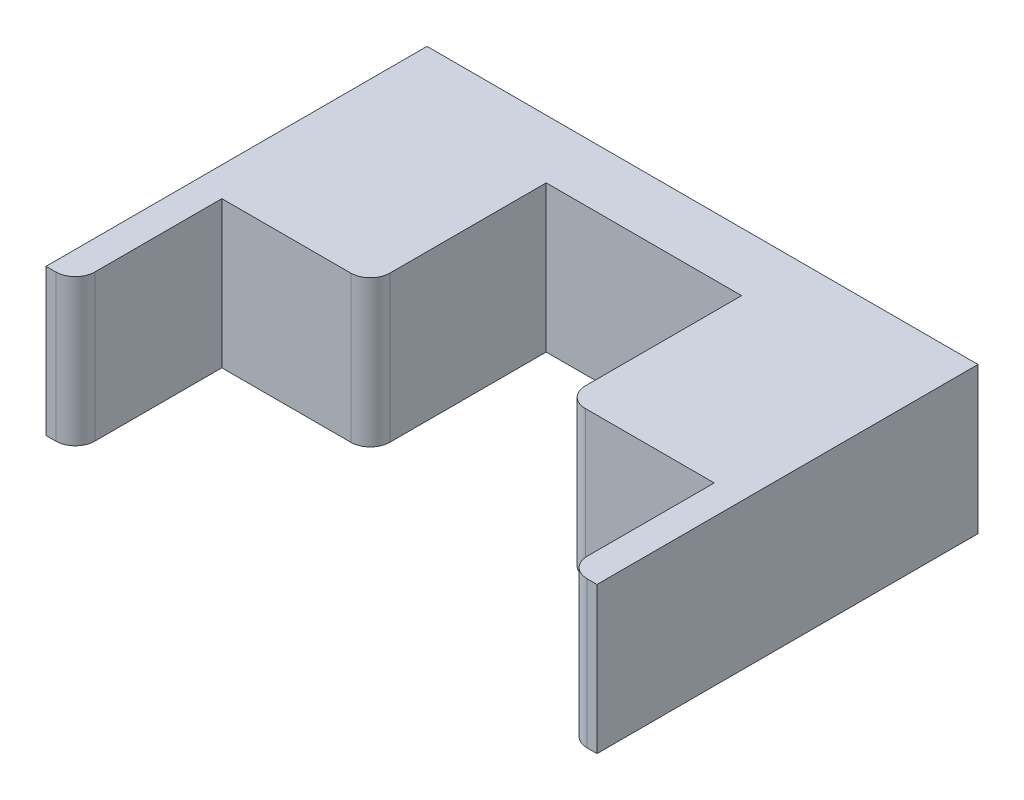
ISO-10303-21;
HEADER;
FILE_DESCRIPTION(('STEP AP214'),'2;1');
FILE_NAME('part.step','',(''),(''),'','','');
FILE_SCHEMA(('AUTOMOTIVE_DESIGN { 1 0 10303 214 1 1 1 1 }'));
ENDSEC;
DATA;
#1=APPLICATION_CONTEXT('core data for automotive mechanical design processes');
#2=APPLICATION_PROTOCOL_DEFINITION('international standard','automotive_design',2000,#1);
#3=PRODUCT_CONTEXT('',#1,'mechanical');
#4=PRODUCT('Part','Part','',(#3));
#5=PRODUCT_RELATED_PRODUCT_CATEGORY('part','',(#4));
#6=PRODUCT_DEFINITION_FORMATION('','',#4);
#7=PRODUCT_DEFINITION_CONTEXT('part definition',#1,'design');
#8=PRODUCT_DEFINITION('design','',#6,#7);
#9=PRODUCT_DEFINITION_SHAPE('','',#8);
#10=(LENGTH_UNIT() NAMED_UNIT(*) SI_UNIT(.MILLI.,.METRE.));
#11=(NAMED_UNIT(*) PLANE_ANGLE_UNIT() SI_UNIT($,.RADIAN.));
#12=(NAMED_UNIT(*) SI_UNIT($,.STERADIAN.) SOLID_ANGLE_UNIT());
#13=UNCERTAINTY_MEASURE_WITH_UNIT(LENGTH_MEASURE(1.E-05),#10,'distance_accuracy_value','');
#14=(GEOMETRIC_REPRESENTATION_CONTEXT(3) GLOBAL_UNCERTAINTY_ASSIGNED_CONTEXT((#13)) GLOBAL_UNIT_ASSIGNED_CONTEXT((#10,
#11,#12)) REPRESENTATION_CONTEXT('',''));
#15=CARTESIAN_POINT('',(0.,0.,0.));
#16=DIRECTION('',(0.,0.,1.));
#17=DIRECTION('',(1.,0.,0.));
#18=AXIS2_PLACEMENT_3D('',#15,#16,#17);
#19=CARTESIAN_POINT('',(-26.4507244637405,15.,-39.1297297297297));
#20=DIRECTION('',(1.,0.,0.));
#21=DIRECTION('',(0.,0.,-1.));
#22=AXIS2_PLACEMENT_3D('',#19,#20,#21);
#23=PLANE('',#22);
#24=DIRECTION('',(0.,0.,1.));
#25=VECTOR('',#24,1.);
#26=CARTESIAN_POINT('',(-26.4507244637405,0.,-39.1297297297297));
#27=LINE('',#26,#25);
#28=CARTESIAN_POINT('',(-26.4507244637405,0.,-39.1297297297297));
#29=VERTEX_POINT('',#28);
#30=CARTESIAN_POINT('',(-26.4507244637405,0.,-0.129729729729727));
#31=VERTEX_POINT('',#30);
#32=EDGE_CURVE('E170',#29,#31,#27,.T.);
#33=ORIENTED_EDGE('',*,*,#32,.T.);
#34=DIRECTION('',(0.,-1.,0.));
#35=VECTOR('',#34,1.);
#36=CARTESIAN_POINT('',(-26.4507244637405,15.,-0.129729729729727));
#37=LINE('',#36,#35);
#38=CARTESIAN_POINT('',(-26.4507244637405,15.,-0.129729729729727));
#39=VERTEX_POINT('',#38);
#40=EDGE_CURVE('E152',#39,#31,#37,.T.);
#41=ORIENTED_EDGE('',*,*,#40,.F.);
#42=DIRECTION('',(0.,0.,1.));
#43=VECTOR('',#42,1.);
#44=CARTESIAN_POINT('',(-26.4507244637405,15.,-39.1297297297297));
#45=LINE('',#44,#43);
#46=CARTESIAN_POINT('',(-26.4507244637405,15.,-39.1297297297297));
#47=VERTEX_POINT('',#46);
#48=EDGE_CURVE('E157',#47,#39,#45,.T.);
#49=ORIENTED_EDGE('',*,*,#48,.F.);
#50=DIRECTION('',(0.,-1.,0.));
#51=VECTOR('',#50,1.);
#52=CARTESIAN_POINT('',(-26.4507244637405,15.,-39.1297297297297));
#53=LINE('',#52,#51);
#54=EDGE_CURVE('E243',#47,#29,#53,.T.);
#55=ORIENTED_EDGE('',*,*,#54,.T.);
#56=EDGE_LOOP('',(#33,#41,#49,#55));
#57=FACE_BOUND('',#56,.T.);
#58=ADVANCED_FACE('F33',(#57),#23,.F.);
#59=CARTESIAN_POINT('',(-26.4507244637405,15.,-0.129729729729727));
#60=DIRECTION('',(0.,0.,-1.));
#61=DIRECTION('',(-1.,0.,0.));
#62=AXIS2_PLACEMENT_3D('',#59,#60,#61);
#63=PLANE('',#62);
#64=DIRECTION('',(1.,0.,0.));
#65=VECTOR('',#64,1.);
#66=CARTESIAN_POINT('',(-26.4507244637405,0.,-0.129729729729727));
#67=LINE('',#66,#65);
#68=CARTESIAN_POINT('',(-25.4507244637405,0.,-0.129729729729727));
#69=VERTEX_POINT('',#68);
#70=EDGE_CURVE('E221',#31,#69,#67,.T.);
#71=ORIENTED_EDGE('',*,*,#70,.T.);
#72=DIRECTION('',(0.,-1.,0.));
#73=VECTOR('',#72,1.);
#74=CARTESIAN_POINT('',(-25.4507244637405,15.,-0.129729729729727));
#75=LINE('',#74,#73);
#76=CARTESIAN_POINT('',(-25.4507244637405,15.,-0.129729729729727));
#77=VERTEX_POINT('',#76);
#78=EDGE_CURVE('E11',#69,#77,#75,.F.);
#79=ORIENTED_EDGE('',*,*,#78,.T.);
#80=DIRECTION('',(1.,0.,0.));
#81=VECTOR('',#80,1.);
#82=CARTESIAN_POINT('',(-26.4507244637405,15.,-0.129729729729727));
#83=LINE('',#82,#81);
#84=EDGE_CURVE('E147',#39,#77,#83,.T.);
#85=ORIENTED_EDGE('',*,*,#84,.F.);
#86=ORIENTED_EDGE('',*,*,#40,.T.);
#87=EDGE_LOOP('',(#71,#79,#85,#86));
#88=FACE_BOUND('',#87,.T.);
#89=ADVANCED_FACE('F150',(#88),#63,.F.);
#90=CARTESIAN_POINT('',(-23.4507244637405,15.,-0.129729729729727));
#91=DIRECTION('',(-1.,0.,0.));
#92=DIRECTION('',(0.,0.,1.));
#93=AXIS2_PLACEMENT_3D('',#90,#91,#92);
#94=PLANE('',#93);
#95=DIRECTION('',(0.,0.,-1.));
#96=VECTOR('',#95,1.);
#97=CARTESIAN_POINT('',(-23.4507244637405,15.,-0.129729729729727));
#98=LINE('',#97,#96);
#99=CARTESIAN_POINT('',(-23.4507244637405,15.,-2.12972972972973));
#100=VERTEX_POINT('',#99);
#101=CARTESIAN_POINT('',(-23.4507244637405,15.,-15.1297297297297));
#102=VERTEX_POINT('',#101);
#103=EDGE_CURVE('E156',#100,#102,#98,.T.);
#104=ORIENTED_EDGE('',*,*,#103,.F.);
#105=DIRECTION('',(0.,-1.,0.));
#106=VECTOR('',#105,1.);
#107=CARTESIAN_POINT('',(-23.4507244637405,15.,-2.12972972972973));
#108=LINE('',#107,#106);
#109=CARTESIAN_POINT('',(-23.4507244637405,0.,-2.12972972972973));
#110=VERTEX_POINT('',#109);
#111=EDGE_CURVE('E41',#100,#110,#108,.T.);
#112=ORIENTED_EDGE('',*,*,#111,.T.);
#113=DIRECTION('',(0.,0.,-1.));
#114=VECTOR('',#113,1.);
#115=CARTESIAN_POINT('',(-23.4507244637405,0.,-0.129729729729727));
#116=LINE('',#115,#114);
#117=CARTESIAN_POINT('',(-23.4507244637405,0.,-15.1297297297297));
#118=VERTEX_POINT('',#117);
#119=EDGE_CURVE('E213',#110,#118,#116,.T.);
#120=ORIENTED_EDGE('',*,*,#119,.T.);
#121=DIRECTION('',(0.,-1.,0.));
#122=VECTOR('',#121,1.);
#123=CARTESIAN_POINT('',(-23.4507244637405,15.,-15.1297297297297));
#124=LINE('',#123,#122);
#125=EDGE_CURVE('E172',#102,#118,#124,.T.);
#126=ORIENTED_EDGE('',*,*,#125,.F.);
#127=EDGE_LOOP('',(#104,#112,#120,#126));
#128=FACE_BOUND('',#127,.T.);
#129=ADVANCED_FACE('F211',(#128),#94,.F.);
#130=CARTESIAN_POINT('',(-23.4507244637405,15.,-15.1297297297297));
#131=DIRECTION('',(0.,0.,-1.));
#132=DIRECTION('',(-1.,0.,0.));
#133=AXIS2_PLACEMENT_3D('',#130,#131,#132);
#134=PLANE('',#133);
#135=DIRECTION('',(1.,0.,0.));
#136=VECTOR('',#135,1.);
#137=CARTESIAN_POINT('',(-23.4507244637405,0.,-15.1297297297297));
#138=LINE('',#137,#136);
#139=CARTESIAN_POINT('',(-10.2507244637405,0.,-15.1297297297297));
#140=VERTEX_POINT('',#139);
#141=EDGE_CURVE('E220',#118,#140,#138,.T.);
#142=ORIENTED_EDGE('',*,*,#141,.T.);
#143=DIRECTION('',(0.,-1.,0.));
#144=VECTOR('',#143,1.);
#145=CARTESIAN_POINT('',(-10.2507244637405,15.,-15.1297297297297));
#146=LINE('',#145,#144);
#147=CARTESIAN_POINT('',(-10.2507244637405,15.,-15.1297297297297));
#148=VERTEX_POINT('',#147);
#149=EDGE_CURVE('E205',#140,#148,#146,.F.);
#150=ORIENTED_EDGE('',*,*,#149,.T.);
#151=DIRECTION('',(1.,0.,0.));
#152=VECTOR('',#151,1.);
#153=CARTESIAN_POINT('',(-23.4507244637405,15.,-15.1297297297297));
#154=LINE('',#153,#152);
#155=EDGE_CURVE('E305',#102,#148,#154,.T.);
#156=ORIENTED_EDGE('',*,*,#155,.F.);
#157=ORIENTED_EDGE('',*,*,#125,.T.);
#158=EDGE_LOOP('',(#142,#150,#156,#157));
#159=FACE_BOUND('',#158,.T.);
#160=ADVANCED_FACE('F311',(#159),#134,.F.);
#161=CARTESIAN_POINT('',(-8.25072446374053,15.,-15.1297297297297));
#162=DIRECTION('',(-1.,0.,0.));
#163=DIRECTION('',(0.,0.,1.));
#164=AXIS2_PLACEMENT_3D('',#161,#162,#163);
#165=PLANE('',#164);
#166=DIRECTION('',(0.,0.,-1.));
#167=VECTOR('',#166,1.);
#168=CARTESIAN_POINT('',(-8.25072446374053,15.,-15.1297297297297));
#169=LINE('',#168,#167);
#170=CARTESIAN_POINT('',(-8.25072446374053,15.,-17.1297297297297));
#171=VERTEX_POINT('',#170);
#172=CARTESIAN_POINT('',(-8.25072446374053,15.,-33.1297297297297));
#173=VERTEX_POINT('',#172);
#174=EDGE_CURVE('E303',#171,#173,#169,.T.);
#175=ORIENTED_EDGE('',*,*,#174,.F.);
#176=DIRECTION('',(0.,-1.,0.));
#177=VECTOR('',#176,1.);
#178=CARTESIAN_POINT('',(-8.25072446374053,15.,-17.1297297297297));
#179=LINE('',#178,#177);
#180=CARTESIAN_POINT('',(-8.25072446374053,0.,-17.1297297297297));
#181=VERTEX_POINT('',#180);
#182=EDGE_CURVE('E202',#171,#181,#179,.T.);
#183=ORIENTED_EDGE('',*,*,#182,.T.);
#184=DIRECTION('',(0.,0.,-1.));
#185=VECTOR('',#184,1.);
#186=CARTESIAN_POINT('',(-8.25072446374053,0.,-15.1297297297297));
#187=LINE('',#186,#185);
#188=CARTESIAN_POINT('',(-8.25072446374053,0.,-33.1297297297297));
#189=VERTEX_POINT('',#188);
#190=EDGE_CURVE('E223',#181,#189,#187,.T.);
#191=ORIENTED_EDGE('',*,*,#190,.T.);
#192=DIRECTION('',(0.,-1.,0.));
#193=VECTOR('',#192,1.);
#194=CARTESIAN_POINT('',(-8.25072446374053,15.,-33.1297297297297));
#195=LINE('',#194,#193);
#196=EDGE_CURVE('E178',#173,#189,#195,.T.);
#197=ORIENTED_EDGE('',*,*,#196,.F.);
#198=EDGE_LOOP('',(#175,#183,#191,#197));
#199=FACE_BOUND('',#198,.T.);
#200=ADVANCED_FACE('F316',(#199),#165,.F.);
#201=CARTESIAN_POINT('',(-8.25072446374053,15.,-33.1297297297297));
#202=DIRECTION('',(0.,0.,-1.));
#203=DIRECTION('',(-1.,0.,0.));
#204=AXIS2_PLACEMENT_3D('',#201,#202,#203);
#205=PLANE('',#204);
#206=DIRECTION('',(1.,0.,0.));
#207=VECTOR('',#206,1.);
#208=CARTESIAN_POINT('',(-8.25072446374053,0.,-33.1297297297297));
#209=LINE('',#208,#207);
#210=CARTESIAN_POINT('',(11.7492755362595,0.,-33.1297297297297));
#211=VERTEX_POINT('',#210);
#212=EDGE_CURVE('E229',#189,#211,#209,.T.);
#213=ORIENTED_EDGE('',*,*,#212,.T.);
#214=DIRECTION('',(0.,-1.,0.));
#215=VECTOR('',#214,1.);
#216=CARTESIAN_POINT('',(11.7492755362595,15.,-33.1297297297297));
#217=LINE('',#216,#215);
#218=CARTESIAN_POINT('',(11.7492755362595,15.,-33.1297297297297));
#219=VERTEX_POINT('',#218);
#220=EDGE_CURVE('E254',#219,#211,#217,.T.);
#221=ORIENTED_EDGE('',*,*,#220,.F.);
#222=DIRECTION('',(1.,0.,0.));
#223=VECTOR('',#222,1.);
#224=CARTESIAN_POINT('',(-8.25072446374053,15.,-33.1297297297297));
#225=LINE('',#224,#223);
#226=EDGE_CURVE('E263',#173,#219,#225,.T.);
#227=ORIENTED_EDGE('',*,*,#226,.F.);
#228=ORIENTED_EDGE('',*,*,#196,.T.);
#229=EDGE_LOOP('',(#213,#221,#227,#228));
#230=FACE_BOUND('',#229,.T.);
#231=ADVANCED_FACE('F261',(#230),#205,.F.);
#232=CARTESIAN_POINT('',(11.7492755362595,15.,-15.1297297297297));
#233=DIRECTION('',(1.,0.,0.));
#234=DIRECTION('',(0.,0.,-1.));
#235=AXIS2_PLACEMENT_3D('',#232,#233,#234);
#236=PLANE('',#235);
#237=DIRECTION('',(0.,0.,1.));
#238=VECTOR('',#237,1.);
#239=CARTESIAN_POINT('',(11.7492755362595,0.,-15.1297297297297));
#240=LINE('',#239,#238);
#241=CARTESIAN_POINT('',(11.7492755362595,0.,-17.1297297297297));
#242=VERTEX_POINT('',#241);
#243=EDGE_CURVE('E231',#211,#242,#240,.T.);
#244=ORIENTED_EDGE('',*,*,#243,.T.);
#245=DIRECTION('',(0.,-1.,0.));
#246=VECTOR('',#245,1.);
#247=CARTESIAN_POINT('',(11.7492755362595,15.,-17.1297297297297));
#248=LINE('',#247,#246);
#249=CARTESIAN_POINT('',(11.7492755362595,15.,-17.1297297297297));
#250=VERTEX_POINT('',#249);
#251=EDGE_CURVE('E56',#242,#250,#248,.F.);
#252=ORIENTED_EDGE('',*,*,#251,.T.);
#253=DIRECTION('',(0.,0.,1.));
#254=VECTOR('',#253,1.);
#255=CARTESIAN_POINT('',(11.7492755362595,15.,-15.1297297297297));
#256=LINE('',#255,#254);
#257=EDGE_CURVE('E300',#219,#250,#256,.T.);
#258=ORIENTED_EDGE('',*,*,#257,.F.);
#259=ORIENTED_EDGE('',*,*,#220,.T.);
#260=EDGE_LOOP('',(#244,#252,#258,#259));
#261=FACE_BOUND('',#260,.T.);
#262=ADVANCED_FACE('F269',(#261),#236,.F.);
#263=CARTESIAN_POINT('',(11.7492755362595,15.,-15.1297297297297));
#264=DIRECTION('',(0.,0.,-1.));
#265=DIRECTION('',(-1.,0.,0.));
#266=AXIS2_PLACEMENT_3D('',#263,#264,#265);
#267=PLANE('',#266);
#268=DIRECTION('',(1.,0.,0.));
#269=VECTOR('',#268,1.);
#270=CARTESIAN_POINT('',(11.7492755362595,15.,-15.1297297297297));
#271=LINE('',#270,#269);
#272=CARTESIAN_POINT('',(13.7492755362595,15.,-15.1297297297297));
#273=VERTEX_POINT('',#272);
#274=CARTESIAN_POINT('',(26.9492755362595,15.,-15.1297297297297));
#275=VERTEX_POINT('',#274);
#276=EDGE_CURVE('E276',#273,#275,#271,.T.);
#277=ORIENTED_EDGE('',*,*,#276,.F.);
#278=DIRECTION('',(0.,-1.,0.));
#279=VECTOR('',#278,1.);
#280=CARTESIAN_POINT('',(13.7492755362595,15.,-15.1297297297297));
#281=LINE('',#280,#279);
#282=CARTESIAN_POINT('',(13.7492755362595,0.,-15.1297297297297));
#283=VERTEX_POINT('',#282);
#284=EDGE_CURVE('E198',#273,#283,#281,.T.);
#285=ORIENTED_EDGE('',*,*,#284,.T.);
#286=DIRECTION('',(1.,0.,0.));
#287=VECTOR('',#286,1.);
#288=CARTESIAN_POINT('',(11.7492755362595,0.,-15.1297297297297));
#289=LINE('',#288,#287);
#290=CARTESIAN_POINT('',(26.9492755362595,0.,-15.1297297297297));
#291=VERTEX_POINT('',#290);
#292=EDGE_CURVE('E233',#283,#291,#289,.T.);
#293=ORIENTED_EDGE('',*,*,#292,.T.);
#294=DIRECTION('',(0.,-1.,0.));
#295=VECTOR('',#294,1.);
#296=CARTESIAN_POINT('',(26.9492755362595,15.,-15.1297297297297));
#297=LINE('',#296,#295);
#298=EDGE_CURVE('E251',#275,#291,#297,.T.);
#299=ORIENTED_EDGE('',*,*,#298,.F.);
#300=EDGE_LOOP('',(#277,#285,#293,#299));
#301=FACE_BOUND('',#300,.T.);
#302=ADVANCED_FACE('F274',(#301),#267,.F.);
#303=CARTESIAN_POINT('',(26.9492755362595,15.,-0.129729729729727));
#304=DIRECTION('',(1.,0.,0.));
#305=DIRECTION('',(0.,0.,-1.));
#306=AXIS2_PLACEMENT_3D('',#303,#304,#305);
#307=PLANE('',#306);
#308=DIRECTION('',(0.,0.,1.));
#309=VECTOR('',#308,1.);
#310=CARTESIAN_POINT('',(26.9492755362595,0.,-0.129729729729727));
#311=LINE('',#310,#309);
#312=CARTESIAN_POINT('',(26.9492755362595,0.,-2.12972972972973));
#313=VERTEX_POINT('',#312);
#314=EDGE_CURVE('E235',#291,#313,#311,.T.);
#315=ORIENTED_EDGE('',*,*,#314,.T.);
#316=DIRECTION('',(0.,-1.,0.));
#317=VECTOR('',#316,1.);
#318=CARTESIAN_POINT('',(26.9492755362595,15.,-2.12972972972973));
#319=LINE('',#318,#317);
#320=CARTESIAN_POINT('',(26.9492755362595,15.,-2.12972972972973));
#321=VERTEX_POINT('',#320);
#322=EDGE_CURVE('E189',#313,#321,#319,.F.);
#323=ORIENTED_EDGE('',*,*,#322,.T.);
#324=DIRECTION('',(0.,0.,1.));
#325=VECTOR('',#324,1.);
#326=CARTESIAN_POINT('',(26.9492755362595,15.,-0.129729729729727));
#327=LINE('',#326,#325);
#328=EDGE_CURVE('E289',#275,#321,#327,.T.);
#329=ORIENTED_EDGE('',*,*,#328,.F.);
#330=ORIENTED_EDGE('',*,*,#298,.T.);
#331=EDGE_LOOP('',(#315,#323,#329,#330));
#332=FACE_BOUND('',#331,.T.);
#333=ADVANCED_FACE('F280',(#332),#307,.F.);
#334=CARTESIAN_POINT('',(26.9492755362595,15.,-0.129729729729727));
#335=DIRECTION('',(0.,0.,-1.));
#336=DIRECTION('',(-1.,0.,0.));
#337=AXIS2_PLACEMENT_3D('',#334,#335,#336);
#338=PLANE('',#337);
#339=DIRECTION('',(1.,0.,0.));
#340=VECTOR('',#339,1.);
#341=CARTESIAN_POINT('',(26.9492755362595,15.,-0.129729729729727));
#342=LINE('',#341,#340);
#343=CARTESIAN_POINT('',(28.9492755362595,15.,-0.129729729729727));
#344=VERTEX_POINT('',#343);
#345=CARTESIAN_POINT('',(29.9492755362595,15.,-0.129729729729727));
#346=VERTEX_POINT('',#345);
#347=EDGE_CURVE('E287',#344,#346,#342,.T.);
#348=ORIENTED_EDGE('',*,*,#347,.F.);
#349=DIRECTION('',(0.,-1.,0.));
#350=VECTOR('',#349,1.);
#351=CARTESIAN_POINT('',(28.9492755362595,15.,-0.129729729729727));
#352=LINE('',#351,#350);
#353=CARTESIAN_POINT('',(28.9492755362595,0.,-0.129729729729727));
#354=VERTEX_POINT('',#353);
#355=EDGE_CURVE('E171',#344,#354,#352,.T.);
#356=ORIENTED_EDGE('',*,*,#355,.T.);
#357=DIRECTION('',(1.,0.,0.));
#358=VECTOR('',#357,1.);
#359=CARTESIAN_POINT('',(26.9492755362595,0.,-0.129729729729727));
#360=LINE('',#359,#358);
#361=CARTESIAN_POINT('',(29.9492755362595,0.,-0.129729729729727));
#362=VERTEX_POINT('',#361);
#363=EDGE_CURVE('E238',#354,#362,#360,.T.);
#364=ORIENTED_EDGE('',*,*,#363,.T.);
#365=DIRECTION('',(0.,-1.,0.));
#366=VECTOR('',#365,1.);
#367=CARTESIAN_POINT('',(29.9492755362595,15.,-0.129729729729727));
#368=LINE('',#367,#366);
#369=EDGE_CURVE('E248',#346,#362,#368,.T.);
#370=ORIENTED_EDGE('',*,*,#369,.F.);
#371=EDGE_LOOP('',(#348,#356,#364,#370));
#372=FACE_BOUND('',#371,.T.);
#373=ADVANCED_FACE('F291',(#372),#338,.F.);
#374=CARTESIAN_POINT('',(29.9492755362595,15.,-39.1297297297297));
#375=DIRECTION('',(-1.,0.,0.));
#376=DIRECTION('',(0.,0.,1.));
#377=AXIS2_PLACEMENT_3D('',#374,#375,#376);
#378=PLANE('',#377);
#379=DIRECTION('',(0.,0.,-1.));
#380=VECTOR('',#379,1.);
#381=CARTESIAN_POINT('',(29.9492755362595,0.,-39.1297297297297));
#382=LINE('',#381,#380);
#383=CARTESIAN_POINT('',(29.9492755362595,0.,-39.1297297297297));
#384=VERTEX_POINT('',#383);
#385=EDGE_CURVE('E240',#362,#384,#382,.T.);
#386=ORIENTED_EDGE('',*,*,#385,.T.);
#387=DIRECTION('',(0.,-1.,0.));
#388=VECTOR('',#387,1.);
#389=CARTESIAN_POINT('',(29.9492755362595,15.,-39.1297297297297));
#390=LINE('',#389,#388);
#391=CARTESIAN_POINT('',(29.9492755362595,15.,-39.1297297297297));
#392=VERTEX_POINT('',#391);
#393=EDGE_CURVE('E245',#392,#384,#390,.T.);
#394=ORIENTED_EDGE('',*,*,#393,.F.);
#395=DIRECTION('',(0.,0.,-1.));
#396=VECTOR('',#395,1.);
#397=CARTESIAN_POINT('',(29.9492755362595,15.,-39.1297297297297));
#398=LINE('',#397,#396);
#399=EDGE_CURVE('E293',#346,#392,#398,.T.);
#400=ORIENTED_EDGE('',*,*,#399,.F.);
#401=ORIENTED_EDGE('',*,*,#369,.T.);
#402=EDGE_LOOP('',(#386,#394,#400,#401));
#403=FACE_BOUND('',#402,.T.);
#404=ADVANCED_FACE('F386',(#403),#378,.F.);
#405=CARTESIAN_POINT('',(-26.4507244637405,15.,-39.1297297297297));
#406=DIRECTION('',(0.,0.,1.));
#407=DIRECTION('',(1.,0.,0.));
#408=AXIS2_PLACEMENT_3D('',#405,#406,#407);
#409=PLANE('',#408);
#410=DIRECTION('',(-1.,0.,0.));
#411=VECTOR('',#410,1.);
#412=CARTESIAN_POINT('',(-26.4507244637405,0.,-39.1297297297297));
#413=LINE('',#412,#411);
#414=EDGE_CURVE('E167',#384,#29,#413,.T.);
#415=ORIENTED_EDGE('',*,*,#414,.T.);
#416=ORIENTED_EDGE('',*,*,#54,.F.);
#417=DIRECTION('',(-1.,0.,0.));
#418=VECTOR('',#417,1.);
#419=CARTESIAN_POINT('',(-26.4507244637405,15.,-39.1297297297297));
#420=LINE('',#419,#418);
#421=EDGE_CURVE('E163',#392,#47,#420,.T.);
#422=ORIENTED_EDGE('',*,*,#421,.F.);
#423=ORIENTED_EDGE('',*,*,#393,.T.);
#424=EDGE_LOOP('',(#415,#416,#422,#423));
#425=FACE_BOUND('',#424,.T.);
#426=ADVANCED_FACE('F375',(#425),#409,.F.);
#427=CARTESIAN_POINT('',(0.,15.,0.));
#428=DIRECTION('',(0.,1.,0.));
#429=DIRECTION('',(0.,0.,1.));
#430=AXIS2_PLACEMENT_3D('',#427,#428,#429);
#431=PLANE('',#430);
#432=ORIENTED_EDGE('',*,*,#328,.T.);
#433=CARTESIAN_POINT('',(28.9492755362595,15.,-2.12972972972973));
#434=DIRECTION('',(0.,1.,0.));
#435=DIRECTION('',(0.,0.,1.));
#436=AXIS2_PLACEMENT_3D('',#433,#434,#435);
#437=CIRCLE('',#436,2.);
#438=EDGE_CURVE('E196',#321,#344,#437,.T.);
#439=ORIENTED_EDGE('',*,*,#438,.T.);
#440=ORIENTED_EDGE('',*,*,#347,.T.);
#441=ORIENTED_EDGE('',*,*,#399,.T.);
#442=ORIENTED_EDGE('',*,*,#421,.T.);
#443=ORIENTED_EDGE('',*,*,#48,.T.);
#444=ORIENTED_EDGE('',*,*,#84,.T.);
#445=CARTESIAN_POINT('',(-25.4507244637405,15.,-2.12972972972973));
#446=DIRECTION('',(0.,1.,0.));
#447=DIRECTION('',(0.,0.,1.));
#448=AXIS2_PLACEMENT_3D('',#445,#446,#447);
#449=CIRCLE('',#448,2.);
#450=EDGE_CURVE('E191',#77,#100,#449,.T.);
#451=ORIENTED_EDGE('',*,*,#450,.T.);
#452=ORIENTED_EDGE('',*,*,#103,.T.);
#453=ORIENTED_EDGE('',*,*,#155,.T.);
#454=CARTESIAN_POINT('',(-10.2507244637405,15.,-17.1297297297297));
#455=DIRECTION('',(0.,1.,0.));
#456=DIRECTION('',(0.,0.,1.));
#457=AXIS2_PLACEMENT_3D('',#454,#455,#456);
#458=CIRCLE('',#457,2.);
#459=EDGE_CURVE('E193',#148,#171,#458,.T.);
#460=ORIENTED_EDGE('',*,*,#459,.T.);
#461=ORIENTED_EDGE('',*,*,#174,.T.);
#462=ORIENTED_EDGE('',*,*,#226,.T.);
#463=ORIENTED_EDGE('',*,*,#257,.T.);
#464=CARTESIAN_POINT('',(13.7492755362595,15.,-17.1297297297297));
#465=DIRECTION('',(0.,1.,0.));
#466=DIRECTION('',(0.,0.,1.));
#467=AXIS2_PLACEMENT_3D('',#464,#465,#466);
#468=CIRCLE('',#467,2.);
#469=EDGE_CURVE('E48',#250,#273,#468,.T.);
#470=ORIENTED_EDGE('',*,*,#469,.T.);
#471=ORIENTED_EDGE('',*,*,#276,.T.);
#472=EDGE_LOOP('',(#432,#439,#440,#441,#442,#443,#444,#451,#452,#453,#460,#461,#462,#463,#470,#471));
#473=FACE_BOUND('',#472,.T.);
#474=ADVANCED_FACE('F161',(#473),#431,.T.);
#475=CARTESIAN_POINT('',(0.,0.,0.));
#476=DIRECTION('',(0.,1.,0.));
#477=DIRECTION('',(0.,0.,1.));
#478=AXIS2_PLACEMENT_3D('',#475,#476,#477);
#479=PLANE('',#478);
#480=ORIENTED_EDGE('',*,*,#363,.F.);
#481=CARTESIAN_POINT('',(28.9492755362595,0.,-2.12972972972973));
#482=DIRECTION('',(0.,1.,0.));
#483=DIRECTION('',(0.,0.,1.));
#484=AXIS2_PLACEMENT_3D('',#481,#482,#483);
#485=CIRCLE('',#484,2.);
#486=EDGE_CURVE('E187',#354,#313,#485,.F.);
#487=ORIENTED_EDGE('',*,*,#486,.T.);
#488=ORIENTED_EDGE('',*,*,#314,.F.);
#489=ORIENTED_EDGE('',*,*,#292,.F.);
#490=CARTESIAN_POINT('',(13.7492755362595,0.,-17.1297297297297));
#491=DIRECTION('',(0.,1.,0.));
#492=DIRECTION('',(0.,0.,1.));
#493=AXIS2_PLACEMENT_3D('',#490,#491,#492);
#494=CIRCLE('',#493,2.);
#495=EDGE_CURVE('E185',#283,#242,#494,.F.);
#496=ORIENTED_EDGE('',*,*,#495,.T.);
#497=ORIENTED_EDGE('',*,*,#243,.F.);
#498=ORIENTED_EDGE('',*,*,#212,.F.);
#499=ORIENTED_EDGE('',*,*,#190,.F.);
#500=CARTESIAN_POINT('',(-10.2507244637405,0.,-17.1297297297297));
#501=DIRECTION('',(0.,1.,0.));
#502=DIRECTION('',(0.,0.,1.));
#503=AXIS2_PLACEMENT_3D('',#500,#501,#502);
#504=CIRCLE('',#503,2.);
#505=EDGE_CURVE('E183',#181,#140,#504,.F.);
#506=ORIENTED_EDGE('',*,*,#505,.T.);
#507=ORIENTED_EDGE('',*,*,#141,.F.);
#508=ORIENTED_EDGE('',*,*,#119,.F.);
#509=CARTESIAN_POINT('',(-25.4507244637405,0.,-2.12972972972973));
#510=DIRECTION('',(0.,1.,0.));
#511=DIRECTION('',(0.,0.,1.));
#512=AXIS2_PLACEMENT_3D('',#509,#510,#511);
#513=CIRCLE('',#512,2.);
#514=EDGE_CURVE('E175',#110,#69,#513,.F.);
#515=ORIENTED_EDGE('',*,*,#514,.T.);
#516=ORIENTED_EDGE('',*,*,#70,.F.);
#517=ORIENTED_EDGE('',*,*,#32,.F.);
#518=ORIENTED_EDGE('',*,*,#414,.F.);
#519=ORIENTED_EDGE('',*,*,#385,.F.);
#520=EDGE_LOOP('',(#480,#487,#488,#489,#496,#497,#498,#499,#506,#507,#508,#515,#516,#517,#518,#519));
#521=FACE_BOUND('',#520,.T.);
#522=ADVANCED_FACE('F218',(#521),#479,.F.);
#523=CARTESIAN_POINT('',(28.9492755362595,15.,-2.12972972972973));
#524=DIRECTION('',(0.,-1.,0.));
#525=DIRECTION('',(0.,0.,-1.));
#526=AXIS2_PLACEMENT_3D('',#523,#524,#525);
#527=CYLINDRICAL_SURFACE('',#526,2.);
#528=ORIENTED_EDGE('',*,*,#438,.F.);
#529=ORIENTED_EDGE('',*,*,#322,.F.);
#530=ORIENTED_EDGE('',*,*,#486,.F.);
#531=ORIENTED_EDGE('',*,*,#355,.F.);
#532=EDGE_LOOP('',(#528,#529,#530,#531));
#533=FACE_BOUND('',#532,.T.);
#534=ADVANCED_FACE('F284',(#533),#527,.T.);
#535=CARTESIAN_POINT('',(13.7492755362595,15.,-17.1297297297297));
#536=DIRECTION('',(0.,-1.,0.));
#537=DIRECTION('',(0.,0.,-1.));
#538=AXIS2_PLACEMENT_3D('',#535,#536,#537);
#539=CYLINDRICAL_SURFACE('',#538,2.);
#540=ORIENTED_EDGE('',*,*,#469,.F.);
#541=ORIENTED_EDGE('',*,*,#251,.F.);
#542=ORIENTED_EDGE('',*,*,#495,.F.);
#543=ORIENTED_EDGE('',*,*,#284,.F.);
#544=EDGE_LOOP('',(#540,#541,#542,#543));
#545=FACE_BOUND('',#544,.T.);
#546=ADVANCED_FACE('F271',(#545),#539,.T.);
#547=CARTESIAN_POINT('',(-10.2507244637405,15.,-17.1297297297297));
#548=DIRECTION('',(0.,-1.,0.));
#549=DIRECTION('',(0.,0.,-1.));
#550=AXIS2_PLACEMENT_3D('',#547,#548,#549);
#551=CYLINDRICAL_SURFACE('',#550,2.);
#552=ORIENTED_EDGE('',*,*,#459,.F.);
#553=ORIENTED_EDGE('',*,*,#149,.F.);
#554=ORIENTED_EDGE('',*,*,#505,.F.);
#555=ORIENTED_EDGE('',*,*,#182,.F.);
#556=EDGE_LOOP('',(#552,#553,#554,#555));
#557=FACE_BOUND('',#556,.T.);
#558=ADVANCED_FACE('F314',(#557),#551,.T.);
#559=CARTESIAN_POINT('',(-25.4507244637405,15.,-2.12972972972973));
#560=DIRECTION('',(0.,-1.,0.));
#561=DIRECTION('',(0.,0.,-1.));
#562=AXIS2_PLACEMENT_3D('',#559,#560,#561);
#563=CYLINDRICAL_SURFACE('',#562,2.);
#564=ORIENTED_EDGE('',*,*,#450,.F.);
#565=ORIENTED_EDGE('',*,*,#78,.F.);
#566=ORIENTED_EDGE('',*,*,#514,.F.);
#567=ORIENTED_EDGE('',*,*,#111,.F.);
#568=EDGE_LOOP('',(#564,#565,#566,#567));
#569=FACE_BOUND('',#568,.T.);
#570=ADVANCED_FACE('F35',(#569),#563,.T.);
#571=CLOSED_SHELL('',(#58,#89,#129,#160,#200,#231,#262,#302,#333,#373,#404,#426,#474,#522,#534,
#546,#558,#570));
#572=MANIFOLD_SOLID_BREP('B2',#571);
#573=ADVANCED_BREP_SHAPE_REPRESENTATION('',(#18,#572),#14);
#574=SHAPE_DEFINITION_REPRESENTATION(#9,#573);
ENDSEC;
END-ISO-10303-21;
